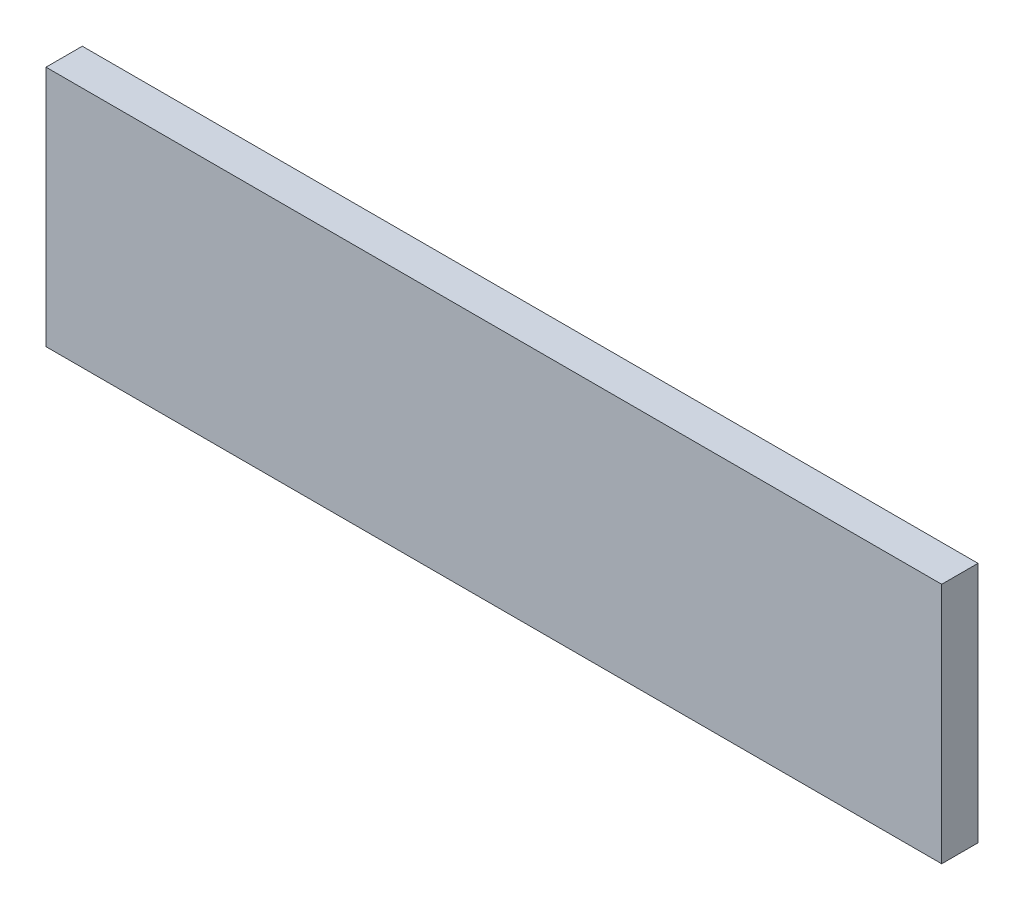
ISO-10303-21;
HEADER;
FILE_DESCRIPTION(('STEP AP214'),'2;1');
FILE_NAME('part.step','',(''),(''),'','','');
FILE_SCHEMA(('AUTOMOTIVE_DESIGN { 1 0 10303 214 1 1 1 1 }'));
ENDSEC;
DATA;
#1=APPLICATION_CONTEXT('core data for automotive mechanical design processes');
#2=APPLICATION_PROTOCOL_DEFINITION('international standard','automotive_design',2000,#1);
#3=PRODUCT_CONTEXT('',#1,'mechanical');
#4=PRODUCT('Part','Part','',(#3));
#5=PRODUCT_RELATED_PRODUCT_CATEGORY('part','',(#4));
#6=PRODUCT_DEFINITION_FORMATION('','',#4);
#7=PRODUCT_DEFINITION_CONTEXT('part definition',#1,'design');
#8=PRODUCT_DEFINITION('design','',#6,#7);
#9=PRODUCT_DEFINITION_SHAPE('','',#8);
#10=(LENGTH_UNIT() NAMED_UNIT(*) SI_UNIT(.MILLI.,.METRE.));
#11=(NAMED_UNIT(*) PLANE_ANGLE_UNIT() SI_UNIT($,.RADIAN.));
#12=(NAMED_UNIT(*) SI_UNIT($,.STERADIAN.) SOLID_ANGLE_UNIT());
#13=UNCERTAINTY_MEASURE_WITH_UNIT(LENGTH_MEASURE(1.E-05),#10,'distance_accuracy_value','');
#14=(GEOMETRIC_REPRESENTATION_CONTEXT(3) GLOBAL_UNCERTAINTY_ASSIGNED_CONTEXT((#13)) GLOBAL_UNIT_ASSIGNED_CONTEXT((#10,
#11,#12)) REPRESENTATION_CONTEXT('',''));
#15=CARTESIAN_POINT('',(0.,0.,0.));
#16=DIRECTION('',(0.,0.,1.));
#17=DIRECTION('',(1.,0.,0.));
#18=AXIS2_PLACEMENT_3D('',#15,#16,#17);
#19=CARTESIAN_POINT('',(37.,-10.,3.));
#20=DIRECTION('',(-1.,0.,0.));
#21=DIRECTION('',(0.,0.,1.));
#22=AXIS2_PLACEMENT_3D('',#19,#20,#21);
#23=PLANE('',#22);
#24=DIRECTION('',(0.,1.,0.));
#25=VECTOR('',#24,1.);
#26=CARTESIAN_POINT('',(37.,-10.,0.));
#27=LINE('',#26,#25);
#28=CARTESIAN_POINT('',(37.,-10.,0.));
#29=VERTEX_POINT('',#28);
#30=CARTESIAN_POINT('',(37.,10.,0.));
#31=VERTEX_POINT('',#30);
#32=EDGE_CURVE('E96',#29,#31,#27,.T.);
#33=ORIENTED_EDGE('',*,*,#32,.T.);
#34=DIRECTION('',(0.,0.,-1.));
#35=VECTOR('',#34,1.);
#36=CARTESIAN_POINT('',(37.,10.,3.));
#37=LINE('',#36,#35);
#38=CARTESIAN_POINT('',(37.,10.,3.));
#39=VERTEX_POINT('',#38);
#40=EDGE_CURVE('E11',#39,#31,#37,.T.);
#41=ORIENTED_EDGE('',*,*,#40,.F.);
#42=DIRECTION('',(0.,1.,0.));
#43=VECTOR('',#42,1.);
#44=CARTESIAN_POINT('',(37.,-10.,3.));
#45=LINE('',#44,#43);
#46=CARTESIAN_POINT('',(37.,-10.,3.));
#47=VERTEX_POINT('',#46);
#48=EDGE_CURVE('E84',#47,#39,#45,.T.);
#49=ORIENTED_EDGE('',*,*,#48,.F.);
#50=DIRECTION('',(0.,0.,-1.));
#51=VECTOR('',#50,1.);
#52=CARTESIAN_POINT('',(37.,-10.,3.));
#53=LINE('',#52,#51);
#54=EDGE_CURVE('E92',#47,#29,#53,.T.);
#55=ORIENTED_EDGE('',*,*,#54,.T.);
#56=EDGE_LOOP('',(#33,#41,#49,#55));
#57=FACE_BOUND('',#56,.T.);
#58=ADVANCED_FACE('F33',(#57),#23,.F.);
#59=CARTESIAN_POINT('',(-37.,10.,3.));
#60=DIRECTION('',(0.,-1.,0.));
#61=DIRECTION('',(0.,0.,-1.));
#62=AXIS2_PLACEMENT_3D('',#59,#60,#61);
#63=PLANE('',#62);
#64=DIRECTION('',(-1.,0.,0.));
#65=VECTOR('',#64,1.);
#66=CARTESIAN_POINT('',(-37.,10.,0.));
#67=LINE('',#66,#65);
#68=CARTESIAN_POINT('',(-37.,10.,0.));
#69=VERTEX_POINT('',#68);
#70=EDGE_CURVE('E88',#31,#69,#67,.T.);
#71=ORIENTED_EDGE('',*,*,#70,.T.);
#72=DIRECTION('',(0.,0.,-1.));
#73=VECTOR('',#72,1.);
#74=CARTESIAN_POINT('',(-37.,10.,3.));
#75=LINE('',#74,#73);
#76=CARTESIAN_POINT('',(-37.,10.,3.));
#77=VERTEX_POINT('',#76);
#78=EDGE_CURVE('E41',#77,#69,#75,.T.);
#79=ORIENTED_EDGE('',*,*,#78,.F.);
#80=DIRECTION('',(-1.,0.,0.));
#81=VECTOR('',#80,1.);
#82=CARTESIAN_POINT('',(-37.,10.,3.));
#83=LINE('',#82,#81);
#84=EDGE_CURVE('E79',#39,#77,#83,.T.);
#85=ORIENTED_EDGE('',*,*,#84,.F.);
#86=ORIENTED_EDGE('',*,*,#40,.T.);
#87=EDGE_LOOP('',(#71,#79,#85,#86));
#88=FACE_BOUND('',#87,.T.);
#89=ADVANCED_FACE('F87',(#88),#63,.F.);
#90=CARTESIAN_POINT('',(-37.,-10.,3.));
#91=DIRECTION('',(1.,0.,0.));
#92=DIRECTION('',(0.,0.,-1.));
#93=AXIS2_PLACEMENT_3D('',#90,#91,#92);
#94=PLANE('',#93);
#95=DIRECTION('',(0.,-1.,0.));
#96=VECTOR('',#95,1.);
#97=CARTESIAN_POINT('',(-37.,-10.,0.));
#98=LINE('',#97,#96);
#99=CARTESIAN_POINT('',(-37.,-10.,0.));
#100=VERTEX_POINT('',#99);
#101=EDGE_CURVE('E66',#69,#100,#98,.T.);
#102=ORIENTED_EDGE('',*,*,#101,.T.);
#103=DIRECTION('',(0.,0.,-1.));
#104=VECTOR('',#103,1.);
#105=CARTESIAN_POINT('',(-37.,-10.,3.));
#106=LINE('',#105,#104);
#107=CARTESIAN_POINT('',(-37.,-10.,3.));
#108=VERTEX_POINT('',#107);
#109=EDGE_CURVE('E89',#108,#100,#106,.T.);
#110=ORIENTED_EDGE('',*,*,#109,.F.);
#111=DIRECTION('',(0.,-1.,0.));
#112=VECTOR('',#111,1.);
#113=CARTESIAN_POINT('',(-37.,-10.,3.));
#114=LINE('',#113,#112);
#115=EDGE_CURVE('E82',#77,#108,#114,.T.);
#116=ORIENTED_EDGE('',*,*,#115,.F.);
#117=ORIENTED_EDGE('',*,*,#78,.T.);
#118=EDGE_LOOP('',(#102,#110,#116,#117));
#119=FACE_BOUND('',#118,.T.);
#120=ADVANCED_FACE('F90',(#119),#94,.F.);
#121=CARTESIAN_POINT('',(-37.,-10.,3.));
#122=DIRECTION('',(0.,1.,0.));
#123=DIRECTION('',(0.,0.,1.));
#124=AXIS2_PLACEMENT_3D('',#121,#122,#123);
#125=PLANE('',#124);
#126=DIRECTION('',(1.,0.,0.));
#127=VECTOR('',#126,1.);
#128=CARTESIAN_POINT('',(-37.,-10.,0.));
#129=LINE('',#128,#127);
#130=EDGE_CURVE('E72',#100,#29,#129,.T.);
#131=ORIENTED_EDGE('',*,*,#130,.T.);
#132=ORIENTED_EDGE('',*,*,#54,.F.);
#133=DIRECTION('',(1.,0.,0.));
#134=VECTOR('',#133,1.);
#135=CARTESIAN_POINT('',(-37.,-10.,3.));
#136=LINE('',#135,#134);
#137=EDGE_CURVE('E49',#108,#47,#136,.T.);
#138=ORIENTED_EDGE('',*,*,#137,.F.);
#139=ORIENTED_EDGE('',*,*,#109,.T.);
#140=EDGE_LOOP('',(#131,#132,#138,#139));
#141=FACE_BOUND('',#140,.T.);
#142=ADVANCED_FACE('F103',(#141),#125,.F.);
#143=CARTESIAN_POINT('',(0.,0.,3.));
#144=DIRECTION('',(0.,0.,-1.));
#145=DIRECTION('',(-1.,0.,0.));
#146=AXIS2_PLACEMENT_3D('',#143,#144,#145);
#147=PLANE('',#146);
#148=ORIENTED_EDGE('',*,*,#48,.T.);
#149=ORIENTED_EDGE('',*,*,#84,.T.);
#150=ORIENTED_EDGE('',*,*,#115,.T.);
#151=ORIENTED_EDGE('',*,*,#137,.T.);
#152=EDGE_LOOP('',(#148,#149,#150,#151));
#153=FACE_BOUND('',#152,.T.);
#154=ADVANCED_FACE('F80',(#153),#147,.F.);
#155=CARTESIAN_POINT('',(0.,0.,0.));
#156=DIRECTION('',(0.,0.,-1.));
#157=DIRECTION('',(-1.,0.,0.));
#158=AXIS2_PLACEMENT_3D('',#155,#156,#157);
#159=PLANE('',#158);
#160=ORIENTED_EDGE('',*,*,#32,.F.);
#161=ORIENTED_EDGE('',*,*,#130,.F.);
#162=ORIENTED_EDGE('',*,*,#101,.F.);
#163=ORIENTED_EDGE('',*,*,#70,.F.);
#164=EDGE_LOOP('',(#160,#161,#162,#163));
#165=FACE_BOUND('',#164,.T.);
#166=ADVANCED_FACE('F106',(#165),#159,.T.);
#167=CLOSED_SHELL('',(#58,#89,#120,#142,#154,#166));
#168=MANIFOLD_SOLID_BREP('B2',#167);
#169=ADVANCED_BREP_SHAPE_REPRESENTATION('',(#18,#168),#14);
#170=SHAPE_DEFINITION_REPRESENTATION(#9,#169);
ENDSEC;
END-ISO-10303-21;
